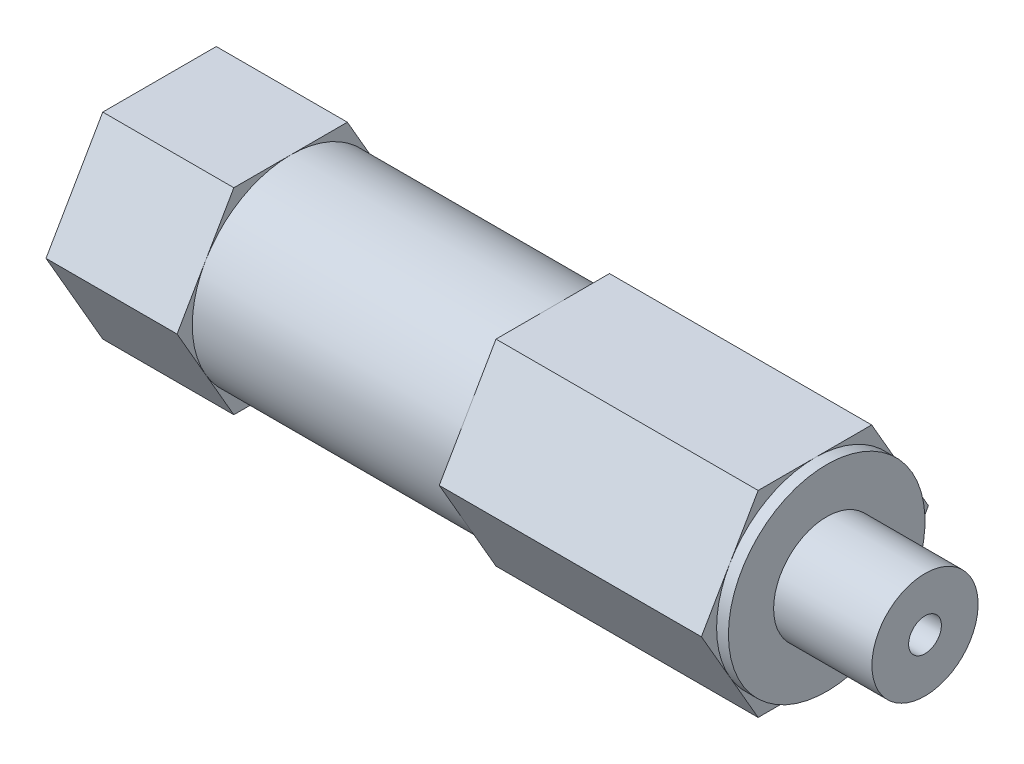
ISO-10303-21;
HEADER;
FILE_DESCRIPTION(('STEP AP214'),'2;1');
FILE_NAME('part.step','',(''),(''),'','','');
FILE_SCHEMA(('AUTOMOTIVE_DESIGN { 1 0 10303 214 1 1 1 1 }'));
ENDSEC;
DATA;
#1=APPLICATION_CONTEXT('core data for automotive mechanical design processes');
#2=APPLICATION_PROTOCOL_DEFINITION('international standard','automotive_design',2000,#1);
#3=PRODUCT_CONTEXT('',#1,'mechanical');
#4=PRODUCT('Part','Part','',(#3));
#5=PRODUCT_RELATED_PRODUCT_CATEGORY('part','',(#4));
#6=PRODUCT_DEFINITION_FORMATION('','',#4);
#7=PRODUCT_DEFINITION_CONTEXT('part definition',#1,'design');
#8=PRODUCT_DEFINITION('design','',#6,#7);
#9=PRODUCT_DEFINITION_SHAPE('','',#8);
#10=(LENGTH_UNIT() NAMED_UNIT(*) SI_UNIT(.MILLI.,.METRE.));
#11=(NAMED_UNIT(*) PLANE_ANGLE_UNIT() SI_UNIT($,.RADIAN.));
#12=(NAMED_UNIT(*) SI_UNIT($,.STERADIAN.) SOLID_ANGLE_UNIT());
#13=UNCERTAINTY_MEASURE_WITH_UNIT(LENGTH_MEASURE(1.E-05),#10,'distance_accuracy_value','');
#14=(GEOMETRIC_REPRESENTATION_CONTEXT(3) GLOBAL_UNCERTAINTY_ASSIGNED_CONTEXT((#13)) GLOBAL_UNIT_ASSIGNED_CONTEXT((#10,
#11,#12)) REPRESENTATION_CONTEXT('',''));
#15=CARTESIAN_POINT('',(0.,0.,0.));
#16=DIRECTION('',(0.,0.,1.));
#17=DIRECTION('',(1.,0.,0.));
#18=AXIS2_PLACEMENT_3D('',#15,#16,#17);
#19=CARTESIAN_POINT('',(0.,0.,0.));
#20=DIRECTION('',(-1.,0.,0.));
#21=DIRECTION('',(0.,0.,1.));
#22=AXIS2_PLACEMENT_3D('',#19,#20,#21);
#23=CYLINDRICAL_SURFACE('',#22,9.525);
#24=CARTESIAN_POINT('',(64.643,0.,0.));
#25=DIRECTION('',(-1.,0.,0.));
#26=DIRECTION('',(0.,0.,1.));
#27=AXIS2_PLACEMENT_3D('',#24,#25,#26);
#28=CIRCLE('',#27,9.525);
#29=CARTESIAN_POINT('',(64.643,0.,9.525));
#30=VERTEX_POINT('',#29);
#31=EDGE_CURVE('E478',#30,#30,#28,.T.);
#32=ORIENTED_EDGE('',*,*,#31,.T.);
#33=EDGE_LOOP('',(#32));
#34=FACE_BOUND('',#33,.T.);
#35=CARTESIAN_POINT('',(63.5,0.,0.));
#36=DIRECTION('',(-1.,0.,0.));
#37=DIRECTION('',(0.,0.,1.));
#38=AXIS2_PLACEMENT_3D('',#35,#36,#37);
#39=CIRCLE('',#38,9.525);
#40=CARTESIAN_POINT('',(63.5,-4.7625,8.24889197104678));
#41=VERTEX_POINT('',#40);
#42=CARTESIAN_POINT('',(63.5,4.7625,8.24889197104678));
#43=VERTEX_POINT('',#42);
#44=EDGE_CURVE('E203',#41,#43,#39,.T.);
#45=ORIENTED_EDGE('',*,*,#44,.F.);
#46=CARTESIAN_POINT('',(63.5,0.,0.));
#47=DIRECTION('',(-1.,0.,0.));
#48=DIRECTION('',(0.,0.,1.));
#49=AXIS2_PLACEMENT_3D('',#46,#47,#48);
#50=CIRCLE('',#49,9.525);
#51=CARTESIAN_POINT('',(63.5,-9.525,0.));
#52=VERTEX_POINT('',#51);
#53=EDGE_CURVE('E241',#52,#41,#50,.T.);
#54=ORIENTED_EDGE('',*,*,#53,.F.);
#55=CARTESIAN_POINT('',(63.5,0.,0.));
#56=DIRECTION('',(-1.,0.,0.));
#57=DIRECTION('',(0.,0.,1.));
#58=AXIS2_PLACEMENT_3D('',#55,#56,#57);
#59=CIRCLE('',#58,9.525);
#60=CARTESIAN_POINT('',(63.5,-4.7625,-8.24889197104678));
#61=VERTEX_POINT('',#60);
#62=EDGE_CURVE('E267',#61,#52,#59,.T.);
#63=ORIENTED_EDGE('',*,*,#62,.F.);
#64=CARTESIAN_POINT('',(63.5,0.,0.));
#65=DIRECTION('',(-1.,0.,0.));
#66=DIRECTION('',(0.,0.,1.));
#67=AXIS2_PLACEMENT_3D('',#64,#65,#66);
#68=CIRCLE('',#67,9.525);
#69=CARTESIAN_POINT('',(63.5,4.7625,-8.24889197104678));
#70=VERTEX_POINT('',#69);
#71=EDGE_CURVE('E280',#70,#61,#68,.T.);
#72=ORIENTED_EDGE('',*,*,#71,.F.);
#73=CARTESIAN_POINT('',(63.5,0.,0.));
#74=DIRECTION('',(-1.,0.,0.));
#75=DIRECTION('',(0.,0.,1.));
#76=AXIS2_PLACEMENT_3D('',#73,#74,#75);
#77=CIRCLE('',#76,9.525);
#78=CARTESIAN_POINT('',(63.5,9.525,0.));
#79=VERTEX_POINT('',#78);
#80=EDGE_CURVE('E319',#79,#70,#77,.T.);
#81=ORIENTED_EDGE('',*,*,#80,.F.);
#82=CARTESIAN_POINT('',(63.5,0.,0.));
#83=DIRECTION('',(-1.,0.,0.));
#84=DIRECTION('',(0.,0.,1.));
#85=AXIS2_PLACEMENT_3D('',#82,#83,#84);
#86=CIRCLE('',#85,9.525);
#87=EDGE_CURVE('E337',#43,#79,#86,.T.);
#88=ORIENTED_EDGE('',*,*,#87,.F.);
#89=EDGE_LOOP('',(#45,#54,#63,#72,#81,#88));
#90=FACE_BOUND('',#89,.T.);
#91=ADVANCED_FACE('F39',(#34,#90),#23,.T.);
#92=CARTESIAN_POINT('',(12.7,0.,0.));
#93=DIRECTION('',(-1.,0.,0.));
#94=DIRECTION('',(0.,0.,1.));
#95=AXIS2_PLACEMENT_3D('',#92,#93,#94);
#96=CIRCLE('',#95,9.525);
#97=CARTESIAN_POINT('',(12.7,-4.7625,8.24889197104678));
#98=VERTEX_POINT('',#97);
#99=CARTESIAN_POINT('',(12.7,4.7625,8.24889197104678));
#100=VERTEX_POINT('',#99);
#101=EDGE_CURVE('E363',#98,#100,#96,.T.);
#102=ORIENTED_EDGE('',*,*,#101,.F.);
#103=CARTESIAN_POINT('',(12.7,0.,0.));
#104=DIRECTION('',(-1.,0.,0.));
#105=DIRECTION('',(0.,0.,1.));
#106=AXIS2_PLACEMENT_3D('',#103,#104,#105);
#107=CIRCLE('',#106,9.525);
#108=CARTESIAN_POINT('',(12.7,-9.525,0.));
#109=VERTEX_POINT('',#108);
#110=EDGE_CURVE('E380',#109,#98,#107,.T.);
#111=ORIENTED_EDGE('',*,*,#110,.F.);
#112=CARTESIAN_POINT('',(12.7,0.,0.));
#113=DIRECTION('',(-1.,0.,0.));
#114=DIRECTION('',(0.,0.,1.));
#115=AXIS2_PLACEMENT_3D('',#112,#113,#114);
#116=CIRCLE('',#115,9.525);
#117=CARTESIAN_POINT('',(12.7,-4.7625,-8.24889197104678));
#118=VERTEX_POINT('',#117);
#119=EDGE_CURVE('E399',#118,#109,#116,.T.);
#120=ORIENTED_EDGE('',*,*,#119,.F.);
#121=CARTESIAN_POINT('',(12.7,0.,0.));
#122=DIRECTION('',(-1.,0.,0.));
#123=DIRECTION('',(0.,0.,1.));
#124=AXIS2_PLACEMENT_3D('',#121,#122,#123);
#125=CIRCLE('',#124,9.525);
#126=CARTESIAN_POINT('',(12.7,4.7625,-8.24889197104678));
#127=VERTEX_POINT('',#126);
#128=EDGE_CURVE('E413',#127,#118,#125,.T.);
#129=ORIENTED_EDGE('',*,*,#128,.F.);
#130=CARTESIAN_POINT('',(12.7,0.,0.));
#131=DIRECTION('',(-1.,0.,0.));
#132=DIRECTION('',(0.,0.,1.));
#133=AXIS2_PLACEMENT_3D('',#130,#131,#132);
#134=CIRCLE('',#133,9.525);
#135=CARTESIAN_POINT('',(12.7,9.525,0.));
#136=VERTEX_POINT('',#135);
#137=EDGE_CURVE('E437',#136,#127,#134,.T.);
#138=ORIENTED_EDGE('',*,*,#137,.F.);
#139=CARTESIAN_POINT('',(12.7,0.,0.));
#140=DIRECTION('',(-1.,0.,0.));
#141=DIRECTION('',(0.,0.,1.));
#142=AXIS2_PLACEMENT_3D('',#139,#140,#141);
#143=CIRCLE('',#142,9.525);
#144=EDGE_CURVE('E455',#100,#136,#143,.T.);
#145=ORIENTED_EDGE('',*,*,#144,.F.);
#146=EDGE_LOOP('',(#102,#111,#120,#129,#138,#145));
#147=FACE_BOUND('',#146,.T.);
#148=CARTESIAN_POINT('',(38.1,0.,0.));
#149=DIRECTION('',(-1.,0.,0.));
#150=DIRECTION('',(0.,0.,1.));
#151=AXIS2_PLACEMENT_3D('',#148,#149,#150);
#152=CIRCLE('',#151,9.525);
#153=CARTESIAN_POINT('',(38.1,-9.525,0.));
#154=VERTEX_POINT('',#153);
#155=CARTESIAN_POINT('',(38.1,-4.7625,8.24889197104678));
#156=VERTEX_POINT('',#155);
#157=EDGE_CURVE('E228',#154,#156,#152,.T.);
#158=ORIENTED_EDGE('',*,*,#157,.T.);
#159=CARTESIAN_POINT('',(38.1,0.,0.));
#160=DIRECTION('',(-1.,0.,0.));
#161=DIRECTION('',(0.,0.,1.));
#162=AXIS2_PLACEMENT_3D('',#159,#160,#161);
#163=CIRCLE('',#162,9.525);
#164=CARTESIAN_POINT('',(38.1,4.7625,8.24889197104678));
#165=VERTEX_POINT('',#164);
#166=EDGE_CURVE('E197',#156,#165,#163,.T.);
#167=ORIENTED_EDGE('',*,*,#166,.T.);
#168=CARTESIAN_POINT('',(38.1,0.,0.));
#169=DIRECTION('',(-1.,0.,0.));
#170=DIRECTION('',(0.,0.,1.));
#171=AXIS2_PLACEMENT_3D('',#168,#169,#170);
#172=CIRCLE('',#171,9.525);
#173=CARTESIAN_POINT('',(38.1,9.525,0.));
#174=VERTEX_POINT('',#173);
#175=EDGE_CURVE('E333',#165,#174,#172,.T.);
#176=ORIENTED_EDGE('',*,*,#175,.T.);
#177=CARTESIAN_POINT('',(38.1,0.,0.));
#178=DIRECTION('',(-1.,0.,0.));
#179=DIRECTION('',(0.,0.,1.));
#180=AXIS2_PLACEMENT_3D('',#177,#178,#179);
#181=CIRCLE('',#180,9.525);
#182=CARTESIAN_POINT('',(38.1,4.7625,-8.24889197104678));
#183=VERTEX_POINT('',#182);
#184=EDGE_CURVE('E307',#174,#183,#181,.T.);
#185=ORIENTED_EDGE('',*,*,#184,.T.);
#186=CARTESIAN_POINT('',(38.1,0.,0.));
#187=DIRECTION('',(-1.,0.,0.));
#188=DIRECTION('',(0.,0.,1.));
#189=AXIS2_PLACEMENT_3D('',#186,#187,#188);
#190=CIRCLE('',#189,9.525);
#191=CARTESIAN_POINT('',(38.1,-4.7625,-8.24889197104678));
#192=VERTEX_POINT('',#191);
#193=EDGE_CURVE('E262',#183,#192,#190,.T.);
#194=ORIENTED_EDGE('',*,*,#193,.T.);
#195=CARTESIAN_POINT('',(38.1,0.,0.));
#196=DIRECTION('',(-1.,0.,0.));
#197=DIRECTION('',(0.,0.,1.));
#198=AXIS2_PLACEMENT_3D('',#195,#196,#197);
#199=CIRCLE('',#198,9.525);
#200=EDGE_CURVE('E253',#192,#154,#199,.T.);
#201=ORIENTED_EDGE('',*,*,#200,.T.);
#202=EDGE_LOOP('',(#158,#167,#176,#185,#194,#201));
#203=FACE_BOUND('',#202,.T.);
#204=ADVANCED_FACE('F526',(#147,#203),#23,.T.);
#205=CARTESIAN_POINT('',(0.,0.,0.));
#206=DIRECTION('',(-1.,0.,0.));
#207=DIRECTION('',(0.,0.,1.));
#208=AXIS2_PLACEMENT_3D('',#205,#206,#207);
#209=CYLINDRICAL_SURFACE('',#208,2.413);
#210=CARTESIAN_POINT('',(31.9174982791419,0.,0.));
#211=DIRECTION('',(-1.,0.,0.));
#212=DIRECTION('',(0.,0.,1.));
#213=AXIS2_PLACEMENT_3D('',#210,#211,#212);
#214=CIRCLE('',#213,2.413);
#215=CARTESIAN_POINT('',(31.9174982791419,0.,2.413));
#216=VERTEX_POINT('',#215);
#217=EDGE_CURVE('E11',#216,#216,#214,.T.);
#218=ORIENTED_EDGE('',*,*,#217,.F.);
#219=EDGE_LOOP('',(#218));
#220=FACE_BOUND('',#219,.T.);
#221=CARTESIAN_POINT('',(25.3082238122816,0.,0.));
#222=DIRECTION('',(-1.,0.,0.));
#223=DIRECTION('',(0.,0.,1.));
#224=AXIS2_PLACEMENT_3D('',#221,#222,#223);
#225=CIRCLE('',#224,2.413);
#226=CARTESIAN_POINT('',(25.3082238122816,0.,2.413));
#227=VERTEX_POINT('',#226);
#228=EDGE_CURVE('E466',#227,#227,#225,.T.);
#229=ORIENTED_EDGE('',*,*,#228,.T.);
#230=EDGE_LOOP('',(#229));
#231=FACE_BOUND('',#230,.T.);
#232=ADVANCED_FACE('F41',(#220,#231),#209,.F.);
#233=CARTESIAN_POINT('',(31.9174982791419,0.,0.));
#234=DIRECTION('',(1.,0.,0.));
#235=DIRECTION('',(0.,0.,-1.));
#236=AXIS2_PLACEMENT_3D('',#233,#234,#235);
#237=CONICAL_SURFACE('',#236,2.413,0.572359888073958);
#238=CARTESIAN_POINT('',(36.7954360071103,0.,0.));
#239=DIRECTION('',(-1.,0.,0.));
#240=DIRECTION('',(0.,0.,1.));
#241=AXIS2_PLACEMENT_3D('',#238,#239,#240);
#242=CIRCLE('',#241,5.55587004745992);
#243=CARTESIAN_POINT('',(36.7954360071103,0.,5.55587004745992));
#244=VERTEX_POINT('',#243);
#245=EDGE_CURVE('E48',#244,#244,#242,.T.);
#246=ORIENTED_EDGE('',*,*,#245,.F.);
#247=EDGE_LOOP('',(#246));
#248=FACE_BOUND('',#247,.T.);
#249=ORIENTED_EDGE('',*,*,#217,.T.);
#250=EDGE_LOOP('',(#249));
#251=FACE_BOUND('',#250,.T.);
#252=ADVANCED_FACE('F519',(#248,#251),#237,.F.);
#253=CARTESIAN_POINT('',(36.7954360071103,5.55587004745992,0.));
#254=DIRECTION('',(-1.,0.,0.));
#255=DIRECTION('',(0.,0.,1.));
#256=AXIS2_PLACEMENT_3D('',#253,#254,#255);
#257=PLANE('',#256);
#258=CARTESIAN_POINT('',(36.7954360071103,0.,0.));
#259=DIRECTION('',(-1.,0.,0.));
#260=DIRECTION('',(0.,0.,1.));
#261=AXIS2_PLACEMENT_3D('',#258,#259,#260);
#262=CIRCLE('',#261,7.53693505791738);
#263=CARTESIAN_POINT('',(36.7954360071103,0.,7.53693505791738));
#264=VERTEX_POINT('',#263);
#265=EDGE_CURVE('E510',#264,#264,#262,.T.);
#266=ORIENTED_EDGE('',*,*,#265,.F.);
#267=EDGE_LOOP('',(#266));
#268=FACE_BOUND('',#267,.T.);
#269=ORIENTED_EDGE('',*,*,#245,.T.);
#270=EDGE_LOOP('',(#269));
#271=FACE_BOUND('',#270,.T.);
#272=ADVANCED_FACE('F517',(#268,#271),#257,.F.);
#273=CARTESIAN_POINT('',(0.,0.,0.));
#274=DIRECTION('',(-1.,0.,0.));
#275=DIRECTION('',(0.,0.,1.));
#276=AXIS2_PLACEMENT_3D('',#273,#274,#275);
#277=CYLINDRICAL_SURFACE('',#276,7.53693505791738);
#278=CARTESIAN_POINT('',(40.4579497008374,0.,0.));
#279=DIRECTION('',(-1.,0.,0.));
#280=DIRECTION('',(0.,0.,1.));
#281=AXIS2_PLACEMENT_3D('',#278,#279,#280);
#282=CIRCLE('',#281,7.53693505791738);
#283=CARTESIAN_POINT('',(40.4579497008374,0.,7.53693505791738));
#284=VERTEX_POINT('',#283);
#285=EDGE_CURVE('E506',#284,#284,#282,.T.);
#286=ORIENTED_EDGE('',*,*,#285,.F.);
#287=EDGE_LOOP('',(#286));
#288=FACE_BOUND('',#287,.T.);
#289=ORIENTED_EDGE('',*,*,#265,.T.);
#290=EDGE_LOOP('',(#289));
#291=FACE_BOUND('',#290,.T.);
#292=ADVANCED_FACE('F621',(#288,#291),#277,.F.);
#293=CARTESIAN_POINT('',(40.4579497008374,7.53693505791738,0.));
#294=DIRECTION('',(1.,0.,0.));
#295=DIRECTION('',(0.,0.,-1.));
#296=AXIS2_PLACEMENT_3D('',#293,#294,#295);
#297=PLANE('',#296);
#298=CARTESIAN_POINT('',(40.4579497008374,0.,0.));
#299=DIRECTION('',(-1.,0.,0.));
#300=DIRECTION('',(0.,0.,1.));
#301=AXIS2_PLACEMENT_3D('',#298,#299,#300);
#302=CIRCLE('',#301,4.58916283032679);
#303=CARTESIAN_POINT('',(40.4579497008374,0.,4.58916283032679));
#304=VERTEX_POINT('',#303);
#305=EDGE_CURVE('E502',#304,#304,#302,.T.);
#306=ORIENTED_EDGE('',*,*,#305,.F.);
#307=EDGE_LOOP('',(#306));
#308=FACE_BOUND('',#307,.T.);
#309=ORIENTED_EDGE('',*,*,#285,.T.);
#310=EDGE_LOOP('',(#309));
#311=FACE_BOUND('',#310,.T.);
#312=ADVANCED_FACE('F617',(#308,#311),#297,.F.);
#313=CARTESIAN_POINT('',(0.,0.,0.));
#314=DIRECTION('',(-1.,0.,0.));
#315=DIRECTION('',(0.,0.,1.));
#316=AXIS2_PLACEMENT_3D('',#313,#314,#315);
#317=CYLINDRICAL_SURFACE('',#316,4.58916283032679);
#318=CARTESIAN_POINT('',(59.7787835902068,0.,0.));
#319=DIRECTION('',(-1.,0.,0.));
#320=DIRECTION('',(0.,0.,1.));
#321=AXIS2_PLACEMENT_3D('',#318,#319,#320);
#322=CIRCLE('',#321,4.58916283032679);
#323=CARTESIAN_POINT('',(59.7787835902068,0.,4.58916283032679));
#324=VERTEX_POINT('',#323);
#325=EDGE_CURVE('E498',#324,#324,#322,.T.);
#326=ORIENTED_EDGE('',*,*,#325,.F.);
#327=EDGE_LOOP('',(#326));
#328=FACE_BOUND('',#327,.T.);
#329=ORIENTED_EDGE('',*,*,#305,.T.);
#330=EDGE_LOOP('',(#329));
#331=FACE_BOUND('',#330,.T.);
#332=ADVANCED_FACE('F613',(#328,#331),#317,.F.);
#333=CARTESIAN_POINT('',(59.7787835902068,4.58916283032679,0.));
#334=DIRECTION('',(1.,0.,0.));
#335=DIRECTION('',(0.,0.,-1.));
#336=AXIS2_PLACEMENT_3D('',#333,#334,#335);
#337=PLANE('',#336);
#338=CARTESIAN_POINT('',(59.7787835902068,0.,0.));
#339=DIRECTION('',(-1.,0.,0.));
#340=DIRECTION('',(0.,0.,1.));
#341=AXIS2_PLACEMENT_3D('',#338,#339,#340);
#342=CIRCLE('',#341,1.5875);
#343=CARTESIAN_POINT('',(59.7787835902068,0.,1.5875));
#344=VERTEX_POINT('',#343);
#345=EDGE_CURVE('E494',#344,#344,#342,.T.);
#346=ORIENTED_EDGE('',*,*,#345,.F.);
#347=EDGE_LOOP('',(#346));
#348=FACE_BOUND('',#347,.T.);
#349=ORIENTED_EDGE('',*,*,#325,.T.);
#350=EDGE_LOOP('',(#349));
#351=FACE_BOUND('',#350,.T.);
#352=ADVANCED_FACE('F609',(#348,#351),#337,.F.);
#353=CARTESIAN_POINT('',(0.,0.,0.));
#354=DIRECTION('',(-1.,0.,0.));
#355=DIRECTION('',(0.,0.,1.));
#356=AXIS2_PLACEMENT_3D('',#353,#354,#355);
#357=CYLINDRICAL_SURFACE('',#356,1.5875);
#358=CARTESIAN_POINT('',(74.168,0.,0.));
#359=DIRECTION('',(-1.,0.,0.));
#360=DIRECTION('',(0.,0.,1.));
#361=AXIS2_PLACEMENT_3D('',#358,#359,#360);
#362=CIRCLE('',#361,1.5875);
#363=CARTESIAN_POINT('',(74.168,0.,1.5875));
#364=VERTEX_POINT('',#363);
#365=EDGE_CURVE('E490',#364,#364,#362,.T.);
#366=ORIENTED_EDGE('',*,*,#365,.F.);
#367=EDGE_LOOP('',(#366));
#368=FACE_BOUND('',#367,.T.);
#369=ORIENTED_EDGE('',*,*,#345,.T.);
#370=EDGE_LOOP('',(#369));
#371=FACE_BOUND('',#370,.T.);
#372=ADVANCED_FACE('F605',(#368,#371),#357,.F.);
#373=CARTESIAN_POINT('',(74.168,1.5875,0.));
#374=DIRECTION('',(-1.,0.,0.));
#375=DIRECTION('',(0.,0.,1.));
#376=AXIS2_PLACEMENT_3D('',#373,#374,#375);
#377=PLANE('',#376);
#378=CARTESIAN_POINT('',(74.168,0.,0.));
#379=DIRECTION('',(-1.,0.,0.));
#380=DIRECTION('',(0.,0.,1.));
#381=AXIS2_PLACEMENT_3D('',#378,#379,#380);
#382=CIRCLE('',#381,5.1435);
#383=CARTESIAN_POINT('',(74.168,0.,5.1435));
#384=VERTEX_POINT('',#383);
#385=EDGE_CURVE('E486',#384,#384,#382,.T.);
#386=ORIENTED_EDGE('',*,*,#385,.F.);
#387=EDGE_LOOP('',(#386));
#388=FACE_BOUND('',#387,.T.);
#389=ORIENTED_EDGE('',*,*,#365,.T.);
#390=EDGE_LOOP('',(#389));
#391=FACE_BOUND('',#390,.T.);
#392=ADVANCED_FACE('F601',(#388,#391),#377,.F.);
#393=CARTESIAN_POINT('',(0.,0.,0.));
#394=DIRECTION('',(-1.,0.,0.));
#395=DIRECTION('',(0.,0.,1.));
#396=AXIS2_PLACEMENT_3D('',#393,#394,#395);
#397=CYLINDRICAL_SURFACE('',#396,5.1435);
#398=CARTESIAN_POINT('',(64.643,0.,0.));
#399=DIRECTION('',(-1.,0.,0.));
#400=DIRECTION('',(0.,0.,1.));
#401=AXIS2_PLACEMENT_3D('',#398,#399,#400);
#402=CIRCLE('',#401,5.1435);
#403=CARTESIAN_POINT('',(64.643,0.,5.1435));
#404=VERTEX_POINT('',#403);
#405=EDGE_CURVE('E482',#404,#404,#402,.T.);
#406=ORIENTED_EDGE('',*,*,#405,.F.);
#407=EDGE_LOOP('',(#406));
#408=FACE_BOUND('',#407,.T.);
#409=ORIENTED_EDGE('',*,*,#385,.T.);
#410=EDGE_LOOP('',(#409));
#411=FACE_BOUND('',#410,.T.);
#412=ADVANCED_FACE('F597',(#408,#411),#397,.T.);
#413=CARTESIAN_POINT('',(64.643,5.1435,0.));
#414=DIRECTION('',(-1.,0.,0.));
#415=DIRECTION('',(0.,0.,1.));
#416=AXIS2_PLACEMENT_3D('',#413,#414,#415);
#417=PLANE('',#416);
#418=ORIENTED_EDGE('',*,*,#31,.F.);
#419=EDGE_LOOP('',(#418));
#420=FACE_BOUND('',#419,.T.);
#421=ORIENTED_EDGE('',*,*,#405,.T.);
#422=EDGE_LOOP('',(#421));
#423=FACE_BOUND('',#422,.T.);
#424=ADVANCED_FACE('F545',(#420,#423),#417,.F.);
#425=CARTESIAN_POINT('',(0.,9.525,0.));
#426=DIRECTION('',(1.,0.,0.));
#427=DIRECTION('',(0.,0.,-1.));
#428=AXIS2_PLACEMENT_3D('',#425,#426,#427);
#429=PLANE('',#428);
#430=CARTESIAN_POINT('',(0.,0.,0.));
#431=DIRECTION('',(-1.,0.,0.));
#432=DIRECTION('',(0.,0.,1.));
#433=AXIS2_PLACEMENT_3D('',#430,#431,#432);
#434=CIRCLE('',#433,4.7625);
#435=CARTESIAN_POINT('',(0.,0.,4.7625));
#436=VERTEX_POINT('',#435);
#437=EDGE_CURVE('E474',#436,#436,#434,.T.);
#438=ORIENTED_EDGE('',*,*,#437,.F.);
#439=EDGE_LOOP('',(#438));
#440=FACE_BOUND('',#439,.T.);
#441=DIRECTION('',(0.,0.,-1.));
#442=VECTOR('',#441,1.);
#443=CARTESIAN_POINT('',(0.,9.525,0.));
#444=LINE('',#443,#442);
#445=CARTESIAN_POINT('',(0.,9.525,5.49926131403118));
#446=VERTEX_POINT('',#445);
#447=CARTESIAN_POINT('',(0.,9.525,-5.49926131403119));
#448=VERTEX_POINT('',#447);
#449=EDGE_CURVE('E452',#446,#448,#444,.T.);
#450=ORIENTED_EDGE('',*,*,#449,.T.);
#451=DIRECTION('',(0.,-0.866025403784439,-0.5));
#452=VECTOR('',#451,1.);
#453=CARTESIAN_POINT('',(0.,4.7625,-8.24889197104678));
#454=LINE('',#453,#452);
#455=CARTESIAN_POINT('',(0.,0.,-10.9985226280624));
#456=VERTEX_POINT('',#455);
#457=EDGE_CURVE('E433',#448,#456,#454,.T.);
#458=ORIENTED_EDGE('',*,*,#457,.T.);
#459=DIRECTION('',(0.,-0.866025403784439,0.5));
#460=VECTOR('',#459,1.);
#461=CARTESIAN_POINT('',(0.,-4.7625,-8.24889197104678));
#462=LINE('',#461,#460);
#463=CARTESIAN_POINT('',(0.,-9.525,-5.49926131403118));
#464=VERTEX_POINT('',#463);
#465=EDGE_CURVE('E415',#456,#464,#462,.T.);
#466=ORIENTED_EDGE('',*,*,#465,.T.);
#467=DIRECTION('',(0.,0.,1.));
#468=VECTOR('',#467,1.);
#469=CARTESIAN_POINT('',(0.,-9.525,0.));
#470=LINE('',#469,#468);
#471=CARTESIAN_POINT('',(0.,-9.525,5.49926131403118));
#472=VERTEX_POINT('',#471);
#473=EDGE_CURVE('E395',#464,#472,#470,.T.);
#474=ORIENTED_EDGE('',*,*,#473,.T.);
#475=DIRECTION('',(0.,0.866025403784439,0.5));
#476=VECTOR('',#475,1.);
#477=CARTESIAN_POINT('',(0.,-4.7625,8.24889197104678));
#478=LINE('',#477,#476);
#479=CARTESIAN_POINT('',(0.,0.,10.9985226280624));
#480=VERTEX_POINT('',#479);
#481=EDGE_CURVE('E375',#472,#480,#478,.T.);
#482=ORIENTED_EDGE('',*,*,#481,.T.);
#483=DIRECTION('',(0.,0.866025403784439,-0.5));
#484=VECTOR('',#483,1.);
#485=CARTESIAN_POINT('',(0.,4.7625,8.24889197104678));
#486=LINE('',#485,#484);
#487=EDGE_CURVE('E436',#480,#446,#486,.T.);
#488=ORIENTED_EDGE('',*,*,#487,.T.);
#489=EDGE_LOOP('',(#450,#458,#466,#474,#482,#488));
#490=FACE_BOUND('',#489,.T.);
#491=ADVANCED_FACE('F539',(#440,#490),#429,.F.);
#492=CARTESIAN_POINT('',(0.,0.,0.));
#493=DIRECTION('',(-1.,0.,0.));
#494=DIRECTION('',(0.,0.,1.));
#495=AXIS2_PLACEMENT_3D('',#492,#493,#494);
#496=CYLINDRICAL_SURFACE('',#495,4.7625);
#497=CARTESIAN_POINT('',(23.7944338485088,0.,0.));
#498=DIRECTION('',(-1.,0.,0.));
#499=DIRECTION('',(0.,0.,1.));
#500=AXIS2_PLACEMENT_3D('',#497,#498,#499);
#501=CIRCLE('',#500,4.7625);
#502=CARTESIAN_POINT('',(23.7944338485088,0.,4.7625));
#503=VERTEX_POINT('',#502);
#504=EDGE_CURVE('E470',#503,#503,#501,.T.);
#505=ORIENTED_EDGE('',*,*,#504,.F.);
#506=EDGE_LOOP('',(#505));
#507=FACE_BOUND('',#506,.T.);
#508=ORIENTED_EDGE('',*,*,#437,.T.);
#509=EDGE_LOOP('',(#508));
#510=FACE_BOUND('',#509,.T.);
#511=ADVANCED_FACE('F533',(#507,#510),#496,.F.);
#512=CARTESIAN_POINT('',(23.7944338485088,0.,0.));
#513=DIRECTION('',(-1.,0.,0.));
#514=DIRECTION('',(0.,0.,1.));
#515=AXIS2_PLACEMENT_3D('',#512,#513,#514);
#516=CONICAL_SURFACE('',#515,4.7625,0.998436438720939);
#517=ORIENTED_EDGE('',*,*,#228,.F.);
#518=EDGE_LOOP('',(#517));
#519=FACE_BOUND('',#518,.T.);
#520=ORIENTED_EDGE('',*,*,#504,.T.);
#521=EDGE_LOOP('',(#520));
#522=FACE_BOUND('',#521,.T.);
#523=ADVANCED_FACE('F529',(#519,#522),#516,.F.);
#524=CARTESIAN_POINT('',(12.7,4.7625,8.24889197104678));
#525=DIRECTION('',(0.,0.5,0.866025403784439));
#526=DIRECTION('',(0.,-0.866025403784439,0.5));
#527=AXIS2_PLACEMENT_3D('',#524,#525,#526);
#528=PLANE('',#527);
#529=ORIENTED_EDGE('',*,*,#487,.F.);
#530=DIRECTION('',(-1.,0.,0.));
#531=VECTOR('',#530,1.);
#532=CARTESIAN_POINT('',(12.7,0.,10.9985226280624));
#533=LINE('',#532,#531);
#534=CARTESIAN_POINT('',(12.7,0.,10.9985226280624));
#535=VERTEX_POINT('',#534);
#536=EDGE_CURVE('E358',#535,#480,#533,.T.);
#537=ORIENTED_EDGE('',*,*,#536,.F.);
#538=DIRECTION('',(0.,0.866025403784439,-0.5));
#539=VECTOR('',#538,1.);
#540=CARTESIAN_POINT('',(12.7,4.7625,8.24889197104678));
#541=LINE('',#540,#539);
#542=EDGE_CURVE('E359',#535,#100,#541,.T.);
#543=ORIENTED_EDGE('',*,*,#542,.T.);
#544=DIRECTION('',(0.,0.866025403784439,-0.5));
#545=VECTOR('',#544,1.);
#546=CARTESIAN_POINT('',(12.7,4.7625,8.24889197104678));
#547=LINE('',#546,#545);
#548=CARTESIAN_POINT('',(12.7,9.525,5.49926131403118));
#549=VERTEX_POINT('',#548);
#550=EDGE_CURVE('E447',#100,#549,#547,.T.);
#551=ORIENTED_EDGE('',*,*,#550,.T.);
#552=DIRECTION('',(-1.,0.,0.));
#553=VECTOR('',#552,1.);
#554=CARTESIAN_POINT('',(12.7,9.525,5.49926131403118));
#555=LINE('',#554,#553);
#556=EDGE_CURVE('E64',#549,#446,#555,.T.);
#557=ORIENTED_EDGE('',*,*,#556,.T.);
#558=EDGE_LOOP('',(#529,#537,#543,#551,#557));
#559=FACE_BOUND('',#558,.T.);
#560=ADVANCED_FACE('F532',(#559),#528,.T.);
#561=CARTESIAN_POINT('',(12.7,9.525,0.));
#562=DIRECTION('',(0.,1.,0.));
#563=DIRECTION('',(0.,0.,1.));
#564=AXIS2_PLACEMENT_3D('',#561,#562,#563);
#565=PLANE('',#564);
#566=ORIENTED_EDGE('',*,*,#449,.F.);
#567=ORIENTED_EDGE('',*,*,#556,.F.);
#568=DIRECTION('',(0.,0.,-1.));
#569=VECTOR('',#568,1.);
#570=CARTESIAN_POINT('',(12.7,9.525,0.));
#571=LINE('',#570,#569);
#572=EDGE_CURVE('E451',#549,#136,#571,.T.);
#573=ORIENTED_EDGE('',*,*,#572,.T.);
#574=DIRECTION('',(0.,0.,-1.));
#575=VECTOR('',#574,1.);
#576=CARTESIAN_POINT('',(12.7,9.525,0.));
#577=LINE('',#576,#575);
#578=CARTESIAN_POINT('',(12.7,9.525,-5.49926131403119));
#579=VERTEX_POINT('',#578);
#580=EDGE_CURVE('E418',#136,#579,#577,.T.);
#581=ORIENTED_EDGE('',*,*,#580,.T.);
#582=DIRECTION('',(-1.,0.,0.));
#583=VECTOR('',#582,1.);
#584=CARTESIAN_POINT('',(12.7,9.525,-5.49926131403119));
#585=LINE('',#584,#583);
#586=EDGE_CURVE('E428',#579,#448,#585,.T.);
#587=ORIENTED_EDGE('',*,*,#586,.T.);
#588=EDGE_LOOP('',(#566,#567,#573,#581,#587));
#589=FACE_BOUND('',#588,.T.);
#590=ADVANCED_FACE('F548',(#589),#565,.T.);
#591=CARTESIAN_POINT('',(12.7,0.,0.));
#592=DIRECTION('',(-1.,0.,0.));
#593=DIRECTION('',(0.,0.,1.));
#594=AXIS2_PLACEMENT_3D('',#591,#592,#593);
#595=PLANE('',#594);
#596=ORIENTED_EDGE('',*,*,#550,.F.);
#597=ORIENTED_EDGE('',*,*,#144,.T.);
#598=ORIENTED_EDGE('',*,*,#572,.F.);
#599=EDGE_LOOP('',(#596,#597,#598));
#600=FACE_BOUND('',#599,.T.);
#601=ADVANCED_FACE('F690',(#600),#595,.F.);
#602=CARTESIAN_POINT('',(12.7,4.7625,-8.24889197104678));
#603=DIRECTION('',(0.,0.5,-0.866025403784439));
#604=DIRECTION('',(0.,0.866025403784439,0.5));
#605=AXIS2_PLACEMENT_3D('',#602,#603,#604);
#606=PLANE('',#605);
#607=ORIENTED_EDGE('',*,*,#457,.F.);
#608=ORIENTED_EDGE('',*,*,#586,.F.);
#609=DIRECTION('',(0.,-0.866025403784439,-0.5));
#610=VECTOR('',#609,1.);
#611=CARTESIAN_POINT('',(12.7,4.7625,-8.24889197104678));
#612=LINE('',#611,#610);
#613=EDGE_CURVE('E432',#579,#127,#612,.T.);
#614=ORIENTED_EDGE('',*,*,#613,.T.);
#615=DIRECTION('',(0.,-0.866025403784439,-0.5));
#616=VECTOR('',#615,1.);
#617=CARTESIAN_POINT('',(12.7,4.7625,-8.24889197104678));
#618=LINE('',#617,#616);
#619=CARTESIAN_POINT('',(12.7,0.,-10.9985226280624));
#620=VERTEX_POINT('',#619);
#621=EDGE_CURVE('E414',#127,#620,#618,.T.);
#622=ORIENTED_EDGE('',*,*,#621,.T.);
#623=DIRECTION('',(-1.,0.,0.));
#624=VECTOR('',#623,1.);
#625=CARTESIAN_POINT('',(12.7,0.,-10.9985226280624));
#626=LINE('',#625,#624);
#627=EDGE_CURVE('E409',#620,#456,#626,.T.);
#628=ORIENTED_EDGE('',*,*,#627,.T.);
#629=EDGE_LOOP('',(#607,#608,#614,#622,#628));
#630=FACE_BOUND('',#629,.T.);
#631=ADVANCED_FACE('F551',(#630),#606,.T.);
#632=CARTESIAN_POINT('',(12.7,0.,0.));
#633=DIRECTION('',(-1.,0.,0.));
#634=DIRECTION('',(0.,0.,1.));
#635=AXIS2_PLACEMENT_3D('',#632,#633,#634);
#636=PLANE('',#635);
#637=ORIENTED_EDGE('',*,*,#580,.F.);
#638=ORIENTED_EDGE('',*,*,#137,.T.);
#639=ORIENTED_EDGE('',*,*,#613,.F.);
#640=EDGE_LOOP('',(#637,#638,#639));
#641=FACE_BOUND('',#640,.T.);
#642=ADVANCED_FACE('F704',(#641),#636,.F.);
#643=CARTESIAN_POINT('',(12.7,-4.7625,-8.24889197104678));
#644=DIRECTION('',(0.,-0.5,-0.866025403784439));
#645=DIRECTION('',(0.,0.866025403784438,-0.5));
#646=AXIS2_PLACEMENT_3D('',#643,#644,#645);
#647=PLANE('',#646);
#648=ORIENTED_EDGE('',*,*,#465,.F.);
#649=ORIENTED_EDGE('',*,*,#627,.F.);
#650=DIRECTION('',(0.,-0.866025403784439,0.5));
#651=VECTOR('',#650,1.);
#652=CARTESIAN_POINT('',(12.7,-4.7625,-8.24889197104678));
#653=LINE('',#652,#651);
#654=EDGE_CURVE('E398',#620,#118,#653,.T.);
#655=ORIENTED_EDGE('',*,*,#654,.T.);
#656=DIRECTION('',(0.,-0.866025403784439,0.5));
#657=VECTOR('',#656,1.);
#658=CARTESIAN_POINT('',(12.7,-4.7625,-8.24889197104678));
#659=LINE('',#658,#657);
#660=CARTESIAN_POINT('',(12.7,-9.525,-5.49926131403118));
#661=VERTEX_POINT('',#660);
#662=EDGE_CURVE('E379',#118,#661,#659,.T.);
#663=ORIENTED_EDGE('',*,*,#662,.T.);
#664=DIRECTION('',(-1.,0.,0.));
#665=VECTOR('',#664,1.);
#666=CARTESIAN_POINT('',(12.7,-9.525,-5.49926131403118));
#667=LINE('',#666,#665);
#668=EDGE_CURVE('E390',#661,#464,#667,.T.);
#669=ORIENTED_EDGE('',*,*,#668,.T.);
#670=EDGE_LOOP('',(#648,#649,#655,#663,#669));
#671=FACE_BOUND('',#670,.T.);
#672=ADVANCED_FACE('F555',(#671),#647,.T.);
#673=CARTESIAN_POINT('',(12.7,0.,0.));
#674=DIRECTION('',(-1.,0.,0.));
#675=DIRECTION('',(0.,0.,1.));
#676=AXIS2_PLACEMENT_3D('',#673,#674,#675);
#677=PLANE('',#676);
#678=ORIENTED_EDGE('',*,*,#128,.T.);
#679=ORIENTED_EDGE('',*,*,#654,.F.);
#680=ORIENTED_EDGE('',*,*,#621,.F.);
#681=EDGE_LOOP('',(#678,#679,#680));
#682=FACE_BOUND('',#681,.T.);
#683=ADVANCED_FACE('F718',(#682),#677,.F.);
#684=CARTESIAN_POINT('',(12.7,-9.525,0.));
#685=DIRECTION('',(0.,-1.,0.));
#686=DIRECTION('',(0.,0.,-1.));
#687=AXIS2_PLACEMENT_3D('',#684,#685,#686);
#688=PLANE('',#687);
#689=ORIENTED_EDGE('',*,*,#473,.F.);
#690=ORIENTED_EDGE('',*,*,#668,.F.);
#691=DIRECTION('',(0.,0.,1.));
#692=VECTOR('',#691,1.);
#693=CARTESIAN_POINT('',(12.7,-9.525,0.));
#694=LINE('',#693,#692);
#695=EDGE_CURVE('E394',#661,#109,#694,.T.);
#696=ORIENTED_EDGE('',*,*,#695,.T.);
#697=DIRECTION('',(0.,0.,1.));
#698=VECTOR('',#697,1.);
#699=CARTESIAN_POINT('',(12.7,-9.525,0.));
#700=LINE('',#699,#698);
#701=CARTESIAN_POINT('',(12.7,-9.525,5.49926131403118));
#702=VERTEX_POINT('',#701);
#703=EDGE_CURVE('E366',#109,#702,#700,.T.);
#704=ORIENTED_EDGE('',*,*,#703,.T.);
#705=DIRECTION('',(-1.,0.,0.));
#706=VECTOR('',#705,1.);
#707=CARTESIAN_POINT('',(12.7,-9.525,5.49926131403118));
#708=LINE('',#707,#706);
#709=EDGE_CURVE('E370',#702,#472,#708,.T.);
#710=ORIENTED_EDGE('',*,*,#709,.T.);
#711=EDGE_LOOP('',(#689,#690,#696,#704,#710));
#712=FACE_BOUND('',#711,.T.);
#713=ADVANCED_FACE('F559',(#712),#688,.T.);
#714=CARTESIAN_POINT('',(12.7,0.,0.));
#715=DIRECTION('',(-1.,0.,0.));
#716=DIRECTION('',(0.,0.,1.));
#717=AXIS2_PLACEMENT_3D('',#714,#715,#716);
#718=PLANE('',#717);
#719=ORIENTED_EDGE('',*,*,#662,.F.);
#720=ORIENTED_EDGE('',*,*,#119,.T.);
#721=ORIENTED_EDGE('',*,*,#695,.F.);
#722=EDGE_LOOP('',(#719,#720,#721));
#723=FACE_BOUND('',#722,.T.);
#724=ADVANCED_FACE('F584',(#723),#718,.F.);
#725=CARTESIAN_POINT('',(12.7,-4.7625,8.24889197104678));
#726=DIRECTION('',(0.,-0.5,0.866025403784439));
#727=DIRECTION('',(0.,-0.866025403784439,-0.5));
#728=AXIS2_PLACEMENT_3D('',#725,#726,#727);
#729=PLANE('',#728);
#730=ORIENTED_EDGE('',*,*,#481,.F.);
#731=ORIENTED_EDGE('',*,*,#709,.F.);
#732=DIRECTION('',(0.,0.866025403784439,0.5));
#733=VECTOR('',#732,1.);
#734=CARTESIAN_POINT('',(12.7,-4.7625,8.24889197104678));
#735=LINE('',#734,#733);
#736=EDGE_CURVE('E374',#702,#98,#735,.T.);
#737=ORIENTED_EDGE('',*,*,#736,.T.);
#738=DIRECTION('',(0.,0.866025403784439,0.5));
#739=VECTOR('',#738,1.);
#740=CARTESIAN_POINT('',(12.7,-4.7625,8.24889197104678));
#741=LINE('',#740,#739);
#742=EDGE_CURVE('E354',#98,#535,#741,.T.);
#743=ORIENTED_EDGE('',*,*,#742,.T.);
#744=ORIENTED_EDGE('',*,*,#536,.T.);
#745=EDGE_LOOP('',(#730,#731,#737,#743,#744));
#746=FACE_BOUND('',#745,.T.);
#747=ADVANCED_FACE('F562',(#746),#729,.T.);
#748=CARTESIAN_POINT('',(12.7,0.,0.));
#749=DIRECTION('',(-1.,0.,0.));
#750=DIRECTION('',(0.,0.,1.));
#751=AXIS2_PLACEMENT_3D('',#748,#749,#750);
#752=PLANE('',#751);
#753=ORIENTED_EDGE('',*,*,#703,.F.);
#754=ORIENTED_EDGE('',*,*,#110,.T.);
#755=ORIENTED_EDGE('',*,*,#736,.F.);
#756=EDGE_LOOP('',(#753,#754,#755));
#757=FACE_BOUND('',#756,.T.);
#758=ADVANCED_FACE('F576',(#757),#752,.F.);
#759=CARTESIAN_POINT('',(12.7,0.,0.));
#760=DIRECTION('',(-1.,0.,0.));
#761=DIRECTION('',(0.,0.,1.));
#762=AXIS2_PLACEMENT_3D('',#759,#760,#761);
#763=PLANE('',#762);
#764=ORIENTED_EDGE('',*,*,#742,.F.);
#765=ORIENTED_EDGE('',*,*,#101,.T.);
#766=ORIENTED_EDGE('',*,*,#542,.F.);
#767=EDGE_LOOP('',(#764,#765,#766));
#768=FACE_BOUND('',#767,.T.);
#769=ADVANCED_FACE('F567',(#768),#763,.F.);
#770=CARTESIAN_POINT('',(63.5,4.7625,8.24889197104678));
#771=DIRECTION('',(0.,0.5,0.866025403784439));
#772=DIRECTION('',(0.,-0.866025403784439,0.5));
#773=AXIS2_PLACEMENT_3D('',#770,#771,#772);
#774=PLANE('',#773);
#775=DIRECTION('',(0.,0.866025403784439,-0.5));
#776=VECTOR('',#775,1.);
#777=CARTESIAN_POINT('',(38.1,4.7625,8.24889197104678));
#778=LINE('',#777,#776);
#779=CARTESIAN_POINT('',(38.1,9.525,5.49926131403118));
#780=VERTEX_POINT('',#779);
#781=EDGE_CURVE('E316',#165,#780,#778,.T.);
#782=ORIENTED_EDGE('',*,*,#781,.F.);
#783=DIRECTION('',(0.,0.866025403784439,-0.5));
#784=VECTOR('',#783,1.);
#785=CARTESIAN_POINT('',(38.1,4.7625,8.24889197104678));
#786=LINE('',#785,#784);
#787=CARTESIAN_POINT('',(38.1,0.,10.9985226280624));
#788=VERTEX_POINT('',#787);
#789=EDGE_CURVE('E192',#788,#165,#786,.T.);
#790=ORIENTED_EDGE('',*,*,#789,.F.);
#791=DIRECTION('',(-1.,0.,0.));
#792=VECTOR('',#791,1.);
#793=CARTESIAN_POINT('',(63.5,0.,10.9985226280624));
#794=LINE('',#793,#792);
#795=CARTESIAN_POINT('',(63.5,0.,10.9985226280624));
#796=VERTEX_POINT('',#795);
#797=EDGE_CURVE('E185',#796,#788,#794,.T.);
#798=ORIENTED_EDGE('',*,*,#797,.F.);
#799=DIRECTION('',(0.,0.866025403784439,-0.5));
#800=VECTOR('',#799,1.);
#801=CARTESIAN_POINT('',(63.5,4.7625,8.24889197104678));
#802=LINE('',#801,#800);
#803=EDGE_CURVE('E190',#796,#43,#802,.T.);
#804=ORIENTED_EDGE('',*,*,#803,.T.);
#805=DIRECTION('',(0.,0.866025403784439,-0.5));
#806=VECTOR('',#805,1.);
#807=CARTESIAN_POINT('',(63.5,4.7625,8.24889197104678));
#808=LINE('',#807,#806);
#809=CARTESIAN_POINT('',(63.5,9.525,5.49926131403118));
#810=VERTEX_POINT('',#809);
#811=EDGE_CURVE('E329',#43,#810,#808,.T.);
#812=ORIENTED_EDGE('',*,*,#811,.T.);
#813=DIRECTION('',(-1.,0.,0.));
#814=VECTOR('',#813,1.);
#815=CARTESIAN_POINT('',(63.5,9.525,5.49926131403118));
#816=LINE('',#815,#814);
#817=EDGE_CURVE('E341',#810,#780,#816,.T.);
#818=ORIENTED_EDGE('',*,*,#817,.T.);
#819=EDGE_LOOP('',(#782,#790,#798,#804,#812,#818));
#820=FACE_BOUND('',#819,.T.);
#821=ADVANCED_FACE('F188',(#820),#774,.T.);
#822=CARTESIAN_POINT('',(63.5,9.525,0.));
#823=DIRECTION('',(0.,1.,0.));
#824=DIRECTION('',(0.,0.,1.));
#825=AXIS2_PLACEMENT_3D('',#822,#823,#824);
#826=PLANE('',#825);
#827=DIRECTION('',(0.,0.,-1.));
#828=VECTOR('',#827,1.);
#829=CARTESIAN_POINT('',(38.1,9.525,0.));
#830=LINE('',#829,#828);
#831=EDGE_CURVE('E345',#780,#174,#830,.T.);
#832=ORIENTED_EDGE('',*,*,#831,.F.);
#833=ORIENTED_EDGE('',*,*,#817,.F.);
#834=DIRECTION('',(0.,0.,-1.));
#835=VECTOR('',#834,1.);
#836=CARTESIAN_POINT('',(63.5,9.525,0.));
#837=LINE('',#836,#835);
#838=EDGE_CURVE('E332',#810,#79,#837,.T.);
#839=ORIENTED_EDGE('',*,*,#838,.T.);
#840=DIRECTION('',(0.,0.,-1.));
#841=VECTOR('',#840,1.);
#842=CARTESIAN_POINT('',(63.5,9.525,0.));
#843=LINE('',#842,#841);
#844=CARTESIAN_POINT('',(63.5,9.525,-5.49926131403119));
#845=VERTEX_POINT('',#844);
#846=EDGE_CURVE('E286',#79,#845,#843,.T.);
#847=ORIENTED_EDGE('',*,*,#846,.T.);
#848=DIRECTION('',(-1.,0.,0.));
#849=VECTOR('',#848,1.);
#850=CARTESIAN_POINT('',(63.5,9.525,-5.49926131403119));
#851=LINE('',#850,#849);
#852=CARTESIAN_POINT('',(38.1,9.525,-5.49926131403119));
#853=VERTEX_POINT('',#852);
#854=EDGE_CURVE('E304',#845,#853,#851,.T.);
#855=ORIENTED_EDGE('',*,*,#854,.T.);
#856=DIRECTION('',(0.,0.,-1.));
#857=VECTOR('',#856,1.);
#858=CARTESIAN_POINT('',(38.1,9.525,0.));
#859=LINE('',#858,#857);
#860=EDGE_CURVE('E55',#174,#853,#859,.T.);
#861=ORIENTED_EDGE('',*,*,#860,.F.);
#862=EDGE_LOOP('',(#832,#833,#839,#847,#855,#861));
#863=FACE_BOUND('',#862,.T.);
#864=ADVANCED_FACE('F773',(#863),#826,.T.);
#865=CARTESIAN_POINT('',(63.5,0.,0.));
#866=DIRECTION('',(-1.,0.,0.));
#867=DIRECTION('',(0.,0.,1.));
#868=AXIS2_PLACEMENT_3D('',#865,#866,#867);
#869=PLANE('',#868);
#870=ORIENTED_EDGE('',*,*,#811,.F.);
#871=ORIENTED_EDGE('',*,*,#87,.T.);
#872=ORIENTED_EDGE('',*,*,#838,.F.);
#873=EDGE_LOOP('',(#870,#871,#872));
#874=FACE_BOUND('',#873,.T.);
#875=ADVANCED_FACE('F783',(#874),#869,.F.);
#876=CARTESIAN_POINT('',(38.1,0.,0.));
#877=DIRECTION('',(-1.,0.,0.));
#878=DIRECTION('',(0.,0.,1.));
#879=AXIS2_PLACEMENT_3D('',#876,#877,#878);
#880=PLANE('',#879);
#881=ORIENTED_EDGE('',*,*,#781,.T.);
#882=ORIENTED_EDGE('',*,*,#831,.T.);
#883=ORIENTED_EDGE('',*,*,#175,.F.);
#884=EDGE_LOOP('',(#881,#882,#883));
#885=FACE_BOUND('',#884,.T.);
#886=ADVANCED_FACE('F792',(#885),#880,.T.);
#887=CARTESIAN_POINT('',(63.5,4.7625,-8.24889197104678));
#888=DIRECTION('',(0.,0.5,-0.866025403784439));
#889=DIRECTION('',(0.,0.866025403784439,0.5));
#890=AXIS2_PLACEMENT_3D('',#887,#888,#889);
#891=PLANE('',#890);
#892=DIRECTION('',(0.,-0.866025403784439,-0.5));
#893=VECTOR('',#892,1.);
#894=CARTESIAN_POINT('',(38.1,4.7625,-8.24889197104678));
#895=LINE('',#894,#893);
#896=EDGE_CURVE('E312',#853,#183,#895,.T.);
#897=ORIENTED_EDGE('',*,*,#896,.F.);
#898=ORIENTED_EDGE('',*,*,#854,.F.);
#899=DIRECTION('',(0.,-0.866025403784439,-0.5));
#900=VECTOR('',#899,1.);
#901=CARTESIAN_POINT('',(63.5,4.7625,-8.24889197104678));
#902=LINE('',#901,#900);
#903=EDGE_CURVE('E311',#845,#70,#902,.T.);
#904=ORIENTED_EDGE('',*,*,#903,.T.);
#905=DIRECTION('',(0.,-0.866025403784439,-0.5));
#906=VECTOR('',#905,1.);
#907=CARTESIAN_POINT('',(63.5,4.7625,-8.24889197104678));
#908=LINE('',#907,#906);
#909=CARTESIAN_POINT('',(63.5,0.,-10.9985226280624));
#910=VERTEX_POINT('',#909);
#911=EDGE_CURVE('E281',#70,#910,#908,.T.);
#912=ORIENTED_EDGE('',*,*,#911,.T.);
#913=DIRECTION('',(-1.,0.,0.));
#914=VECTOR('',#913,1.);
#915=CARTESIAN_POINT('',(63.5,0.,-10.9985226280624));
#916=LINE('',#915,#914);
#917=CARTESIAN_POINT('',(38.1,0.,-10.9985226280624));
#918=VERTEX_POINT('',#917);
#919=EDGE_CURVE('E277',#910,#918,#916,.T.);
#920=ORIENTED_EDGE('',*,*,#919,.T.);
#921=DIRECTION('',(0.,-0.866025403784439,-0.5));
#922=VECTOR('',#921,1.);
#923=CARTESIAN_POINT('',(38.1,4.7625,-8.24889197104678));
#924=LINE('',#923,#922);
#925=EDGE_CURVE('E287',#183,#918,#924,.T.);
#926=ORIENTED_EDGE('',*,*,#925,.F.);
#927=EDGE_LOOP('',(#897,#898,#904,#912,#920,#926));
#928=FACE_BOUND('',#927,.T.);
#929=ADVANCED_FACE('F802',(#928),#891,.T.);
#930=CARTESIAN_POINT('',(63.5,0.,0.));
#931=DIRECTION('',(-1.,0.,0.));
#932=DIRECTION('',(0.,0.,1.));
#933=AXIS2_PLACEMENT_3D('',#930,#931,#932);
#934=PLANE('',#933);
#935=ORIENTED_EDGE('',*,*,#846,.F.);
#936=ORIENTED_EDGE('',*,*,#80,.T.);
#937=ORIENTED_EDGE('',*,*,#903,.F.);
#938=EDGE_LOOP('',(#935,#936,#937));
#939=FACE_BOUND('',#938,.T.);
#940=ADVANCED_FACE('F813',(#939),#934,.F.);
#941=CARTESIAN_POINT('',(38.1,0.,0.));
#942=DIRECTION('',(-1.,0.,0.));
#943=DIRECTION('',(0.,0.,1.));
#944=AXIS2_PLACEMENT_3D('',#941,#942,#943);
#945=PLANE('',#944);
#946=ORIENTED_EDGE('',*,*,#860,.T.);
#947=ORIENTED_EDGE('',*,*,#896,.T.);
#948=ORIENTED_EDGE('',*,*,#184,.F.);
#949=EDGE_LOOP('',(#946,#947,#948));
#950=FACE_BOUND('',#949,.T.);
#951=ADVANCED_FACE('F823',(#950),#945,.T.);
#952=CARTESIAN_POINT('',(63.5,-4.7625,-8.24889197104678));
#953=DIRECTION('',(0.,-0.5,-0.866025403784439));
#954=DIRECTION('',(0.,0.866025403784439,-0.5));
#955=AXIS2_PLACEMENT_3D('',#952,#953,#954);
#956=PLANE('',#955);
#957=DIRECTION('',(0.,-0.866025403784439,0.5));
#958=VECTOR('',#957,1.);
#959=CARTESIAN_POINT('',(38.1,-4.7625,-8.24889197104678));
#960=LINE('',#959,#958);
#961=EDGE_CURVE('E282',#918,#192,#960,.T.);
#962=ORIENTED_EDGE('',*,*,#961,.F.);
#963=ORIENTED_EDGE('',*,*,#919,.F.);
#964=DIRECTION('',(0.,-0.866025403784439,0.5));
#965=VECTOR('',#964,1.);
#966=CARTESIAN_POINT('',(63.5,-4.7625,-8.24889197104678));
#967=LINE('',#966,#965);
#968=EDGE_CURVE('E294',#910,#61,#967,.T.);
#969=ORIENTED_EDGE('',*,*,#968,.T.);
#970=DIRECTION('',(0.,-0.866025403784439,0.5));
#971=VECTOR('',#970,1.);
#972=CARTESIAN_POINT('',(63.5,-4.7625,-8.24889197104678));
#973=LINE('',#972,#971);
#974=CARTESIAN_POINT('',(63.5,-9.525,-5.49926131403118));
#975=VERTEX_POINT('',#974);
#976=EDGE_CURVE('E236',#61,#975,#973,.T.);
#977=ORIENTED_EDGE('',*,*,#976,.T.);
#978=DIRECTION('',(-1.,0.,0.));
#979=VECTOR('',#978,1.);
#980=CARTESIAN_POINT('',(63.5,-9.525,-5.49926131403118));
#981=LINE('',#980,#979);
#982=CARTESIAN_POINT('',(38.1,-9.525,-5.49926131403118));
#983=VERTEX_POINT('',#982);
#984=EDGE_CURVE('E250',#975,#983,#981,.T.);
#985=ORIENTED_EDGE('',*,*,#984,.T.);
#986=DIRECTION('',(0.,-0.866025403784439,0.5));
#987=VECTOR('',#986,1.);
#988=CARTESIAN_POINT('',(38.1,-4.7625,-8.24889197104678));
#989=LINE('',#988,#987);
#990=EDGE_CURVE('E263',#192,#983,#989,.T.);
#991=ORIENTED_EDGE('',*,*,#990,.F.);
#992=EDGE_LOOP('',(#962,#963,#969,#977,#985,#991));
#993=FACE_BOUND('',#992,.T.);
#994=ADVANCED_FACE('F833',(#993),#956,.T.);
#995=CARTESIAN_POINT('',(63.5,0.,0.));
#996=DIRECTION('',(-1.,0.,0.));
#997=DIRECTION('',(0.,0.,1.));
#998=AXIS2_PLACEMENT_3D('',#995,#996,#997);
#999=PLANE('',#998);
#1000=ORIENTED_EDGE('',*,*,#71,.T.);
#1001=ORIENTED_EDGE('',*,*,#968,.F.);
#1002=ORIENTED_EDGE('',*,*,#911,.F.);
#1003=EDGE_LOOP('',(#1000,#1001,#1002));
#1004=FACE_BOUND('',#1003,.T.);
#1005=ADVANCED_FACE('F844',(#1004),#999,.F.);
#1006=CARTESIAN_POINT('',(38.1,0.,0.));
#1007=DIRECTION('',(-1.,0.,0.));
#1008=DIRECTION('',(0.,0.,1.));
#1009=AXIS2_PLACEMENT_3D('',#1006,#1007,#1008);
#1010=PLANE('',#1009);
#1011=ORIENTED_EDGE('',*,*,#193,.F.);
#1012=ORIENTED_EDGE('',*,*,#925,.T.);
#1013=ORIENTED_EDGE('',*,*,#961,.T.);
#1014=EDGE_LOOP('',(#1011,#1012,#1013));
#1015=FACE_BOUND('',#1014,.T.);
#1016=ADVANCED_FACE('F854',(#1015),#1010,.T.);
#1017=CARTESIAN_POINT('',(63.5,-9.525,0.));
#1018=DIRECTION('',(0.,-1.,0.));
#1019=DIRECTION('',(0.,0.,-1.));
#1020=AXIS2_PLACEMENT_3D('',#1017,#1018,#1019);
#1021=PLANE('',#1020);
#1022=DIRECTION('',(0.,0.,1.));
#1023=VECTOR('',#1022,1.);
#1024=CARTESIAN_POINT('',(38.1,-9.525,0.));
#1025=LINE('',#1024,#1023);
#1026=EDGE_CURVE('E258',#983,#154,#1025,.T.);
#1027=ORIENTED_EDGE('',*,*,#1026,.F.);
#1028=ORIENTED_EDGE('',*,*,#984,.F.);
#1029=DIRECTION('',(0.,0.,1.));
#1030=VECTOR('',#1029,1.);
#1031=CARTESIAN_POINT('',(63.5,-9.525,0.));
#1032=LINE('',#1031,#1030);
#1033=EDGE_CURVE('E257',#975,#52,#1032,.T.);
#1034=ORIENTED_EDGE('',*,*,#1033,.T.);
#1035=DIRECTION('',(0.,0.,1.));
#1036=VECTOR('',#1035,1.);
#1037=CARTESIAN_POINT('',(63.5,-9.525,0.));
#1038=LINE('',#1037,#1036);
#1039=CARTESIAN_POINT('',(63.5,-9.525,5.49926131403118));
#1040=VERTEX_POINT('',#1039);
#1041=EDGE_CURVE('E221',#52,#1040,#1038,.T.);
#1042=ORIENTED_EDGE('',*,*,#1041,.T.);
#1043=DIRECTION('',(-1.,0.,0.));
#1044=VECTOR('',#1043,1.);
#1045=CARTESIAN_POINT('',(63.5,-9.525,5.49926131403118));
#1046=LINE('',#1045,#1044);
#1047=CARTESIAN_POINT('',(38.1,-9.525,5.49926131403118));
#1048=VERTEX_POINT('',#1047);
#1049=EDGE_CURVE('E225',#1040,#1048,#1046,.T.);
#1050=ORIENTED_EDGE('',*,*,#1049,.T.);
#1051=DIRECTION('',(0.,0.,1.));
#1052=VECTOR('',#1051,1.);
#1053=CARTESIAN_POINT('',(38.1,-9.525,0.));
#1054=LINE('',#1053,#1052);
#1055=EDGE_CURVE('E237',#154,#1048,#1054,.T.);
#1056=ORIENTED_EDGE('',*,*,#1055,.F.);
#1057=EDGE_LOOP('',(#1027,#1028,#1034,#1042,#1050,#1056));
#1058=FACE_BOUND('',#1057,.T.);
#1059=ADVANCED_FACE('F864',(#1058),#1021,.T.);
#1060=CARTESIAN_POINT('',(63.5,0.,0.));
#1061=DIRECTION('',(-1.,0.,0.));
#1062=DIRECTION('',(0.,0.,1.));
#1063=AXIS2_PLACEMENT_3D('',#1060,#1061,#1062);
#1064=PLANE('',#1063);
#1065=ORIENTED_EDGE('',*,*,#976,.F.);
#1066=ORIENTED_EDGE('',*,*,#62,.T.);
#1067=ORIENTED_EDGE('',*,*,#1033,.F.);
#1068=EDGE_LOOP('',(#1065,#1066,#1067));
#1069=FACE_BOUND('',#1068,.T.);
#1070=ADVANCED_FACE('F875',(#1069),#1064,.F.);
#1071=CARTESIAN_POINT('',(38.1,0.,0.));
#1072=DIRECTION('',(-1.,0.,0.));
#1073=DIRECTION('',(0.,0.,1.));
#1074=AXIS2_PLACEMENT_3D('',#1071,#1072,#1073);
#1075=PLANE('',#1074);
#1076=ORIENTED_EDGE('',*,*,#990,.T.);
#1077=ORIENTED_EDGE('',*,*,#1026,.T.);
#1078=ORIENTED_EDGE('',*,*,#200,.F.);
#1079=EDGE_LOOP('',(#1076,#1077,#1078));
#1080=FACE_BOUND('',#1079,.T.);
#1081=ADVANCED_FACE('F885',(#1080),#1075,.T.);
#1082=CARTESIAN_POINT('',(63.5,-4.7625,8.24889197104678));
#1083=DIRECTION('',(0.,-0.5,0.866025403784439));
#1084=DIRECTION('',(0.,-0.866025403784439,-0.5));
#1085=AXIS2_PLACEMENT_3D('',#1082,#1083,#1084);
#1086=PLANE('',#1085);
#1087=DIRECTION('',(0.,0.866025403784439,0.5));
#1088=VECTOR('',#1087,1.);
#1089=CARTESIAN_POINT('',(38.1,-4.7625,8.24889197104678));
#1090=LINE('',#1089,#1088);
#1091=EDGE_CURVE('E232',#1048,#156,#1090,.T.);
#1092=ORIENTED_EDGE('',*,*,#1091,.F.);
#1093=ORIENTED_EDGE('',*,*,#1049,.F.);
#1094=DIRECTION('',(0.,0.866025403784439,0.5));
#1095=VECTOR('',#1094,1.);
#1096=CARTESIAN_POINT('',(63.5,-4.7625,8.24889197104678));
#1097=LINE('',#1096,#1095);
#1098=EDGE_CURVE('E210',#1040,#41,#1097,.T.);
#1099=ORIENTED_EDGE('',*,*,#1098,.T.);
#1100=DIRECTION('',(0.,0.866025403784439,0.5));
#1101=VECTOR('',#1100,1.);
#1102=CARTESIAN_POINT('',(63.5,-4.7625,8.24889197104678));
#1103=LINE('',#1102,#1101);
#1104=EDGE_CURVE('E198',#41,#796,#1103,.T.);
#1105=ORIENTED_EDGE('',*,*,#1104,.T.);
#1106=ORIENTED_EDGE('',*,*,#797,.T.);
#1107=DIRECTION('',(0.,0.866025403784439,0.5));
#1108=VECTOR('',#1107,1.);
#1109=CARTESIAN_POINT('',(38.1,-4.7625,8.24889197104678));
#1110=LINE('',#1109,#1108);
#1111=EDGE_CURVE('E216',#156,#788,#1110,.T.);
#1112=ORIENTED_EDGE('',*,*,#1111,.F.);
#1113=EDGE_LOOP('',(#1092,#1093,#1099,#1105,#1106,#1112));
#1114=FACE_BOUND('',#1113,.T.);
#1115=ADVANCED_FACE('F208',(#1114),#1086,.T.);
#1116=CARTESIAN_POINT('',(63.5,0.,0.));
#1117=DIRECTION('',(-1.,0.,0.));
#1118=DIRECTION('',(0.,0.,1.));
#1119=AXIS2_PLACEMENT_3D('',#1116,#1117,#1118);
#1120=PLANE('',#1119);
#1121=ORIENTED_EDGE('',*,*,#1041,.F.);
#1122=ORIENTED_EDGE('',*,*,#53,.T.);
#1123=ORIENTED_EDGE('',*,*,#1098,.F.);
#1124=EDGE_LOOP('',(#1121,#1122,#1123));
#1125=FACE_BOUND('',#1124,.T.);
#1126=ADVANCED_FACE('F905',(#1125),#1120,.F.);
#1127=CARTESIAN_POINT('',(38.1,0.,0.));
#1128=DIRECTION('',(-1.,0.,0.));
#1129=DIRECTION('',(0.,0.,1.));
#1130=AXIS2_PLACEMENT_3D('',#1127,#1128,#1129);
#1131=PLANE('',#1130);
#1132=ORIENTED_EDGE('',*,*,#1055,.T.);
#1133=ORIENTED_EDGE('',*,*,#1091,.T.);
#1134=ORIENTED_EDGE('',*,*,#157,.F.);
#1135=EDGE_LOOP('',(#1132,#1133,#1134));
#1136=FACE_BOUND('',#1135,.T.);
#1137=ADVANCED_FACE('F914',(#1136),#1131,.T.);
#1138=CARTESIAN_POINT('',(63.5,0.,0.));
#1139=DIRECTION('',(-1.,0.,0.));
#1140=DIRECTION('',(0.,0.,1.));
#1141=AXIS2_PLACEMENT_3D('',#1138,#1139,#1140);
#1142=PLANE('',#1141);
#1143=ORIENTED_EDGE('',*,*,#1104,.F.);
#1144=ORIENTED_EDGE('',*,*,#44,.T.);
#1145=ORIENTED_EDGE('',*,*,#803,.F.);
#1146=EDGE_LOOP('',(#1143,#1144,#1145));
#1147=FACE_BOUND('',#1146,.T.);
#1148=ADVANCED_FACE('F201',(#1147),#1142,.F.);
#1149=CARTESIAN_POINT('',(38.1,0.,0.));
#1150=DIRECTION('',(-1.,0.,0.));
#1151=DIRECTION('',(0.,0.,1.));
#1152=AXIS2_PLACEMENT_3D('',#1149,#1150,#1151);
#1153=PLANE('',#1152);
#1154=ORIENTED_EDGE('',*,*,#1111,.T.);
#1155=ORIENTED_EDGE('',*,*,#789,.T.);
#1156=ORIENTED_EDGE('',*,*,#166,.F.);
#1157=EDGE_LOOP('',(#1154,#1155,#1156));
#1158=FACE_BOUND('',#1157,.T.);
#1159=ADVANCED_FACE('F933',(#1158),#1153,.T.);
#1160=CLOSED_SHELL('',(#91,#204,#232,#252,#272,#292,#312,#332,#352,#372,#392,#412,#424,#491,
#511,#523,#560,#590,#601,#631,#642,#672,#683,#713,#724,#747,#758,#769,#821,#864,#875,#886,#929,
#940,#951,#994,#1005,#1016,#1059,#1070,#1081,#1115,#1126,#1137,#1148,#1159));
#1161=MANIFOLD_SOLID_BREP('B2',#1160);
#1162=ADVANCED_BREP_SHAPE_REPRESENTATION('',(#18,#1161),#14);
#1163=SHAPE_DEFINITION_REPRESENTATION(#9,#1162);
ENDSEC;
END-ISO-10303-21;
